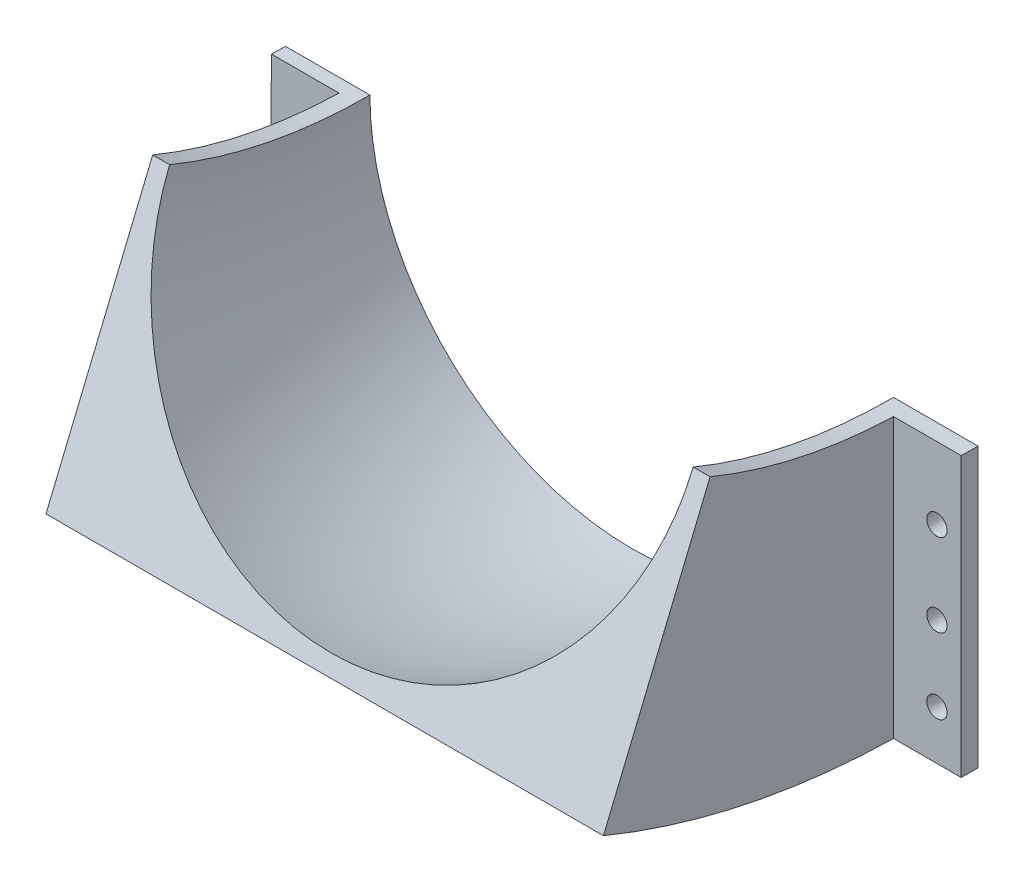
ISO-10303-21;
HEADER;
FILE_DESCRIPTION(('STEP AP214'),'2;1');
FILE_NAME('part.step','',(''),(''),'','','');
FILE_SCHEMA(('AUTOMOTIVE_DESIGN { 1 0 10303 214 1 1 1 1 }'));
ENDSEC;
DATA;
#1=APPLICATION_CONTEXT('core data for automotive mechanical design processes');
#2=APPLICATION_PROTOCOL_DEFINITION('international standard','automotive_design',2000,#1);
#3=PRODUCT_CONTEXT('',#1,'mechanical');
#4=PRODUCT('Part','Part','',(#3));
#5=PRODUCT_RELATED_PRODUCT_CATEGORY('part','',(#4));
#6=PRODUCT_DEFINITION_FORMATION('','',#4);
#7=PRODUCT_DEFINITION_CONTEXT('part definition',#1,'design');
#8=PRODUCT_DEFINITION('design','',#6,#7);
#9=PRODUCT_DEFINITION_SHAPE('','',#8);
#10=(LENGTH_UNIT() NAMED_UNIT(*) SI_UNIT(.MILLI.,.METRE.));
#11=(NAMED_UNIT(*) PLANE_ANGLE_UNIT() SI_UNIT($,.RADIAN.));
#12=(NAMED_UNIT(*) SI_UNIT($,.STERADIAN.) SOLID_ANGLE_UNIT());
#13=UNCERTAINTY_MEASURE_WITH_UNIT(LENGTH_MEASURE(1.E-05),#10,'distance_accuracy_value','');
#14=(GEOMETRIC_REPRESENTATION_CONTEXT(3) GLOBAL_UNCERTAINTY_ASSIGNED_CONTEXT((#13)) GLOBAL_UNIT_ASSIGNED_CONTEXT((#10,
#11,#12)) REPRESENTATION_CONTEXT('',''));
#15=CARTESIAN_POINT('',(0.,0.,0.));
#16=DIRECTION('',(0.,0.,1.));
#17=DIRECTION('',(1.,0.,0.));
#18=AXIS2_PLACEMENT_3D('',#15,#16,#17);
#19=CARTESIAN_POINT('',(52.4001999999994,-90.9328429874235,37.6656168305343));
#20=DIRECTION('',(-1.,0.,0.));
#21=DIRECTION('',(0.,0.,1.));
#22=AXIS2_PLACEMENT_3D('',#19,#20,#21);
#23=PLANE('',#22);
#24=DIRECTION('',(0.,-0.0105254294375171,-0.999944606133338));
#25=VECTOR('',#24,1.);
#26=CARTESIAN_POINT('',(52.4002000000002,-150.8252,0.));
#27=LINE('',#26,#25);
#28=CARTESIAN_POINT('',(52.4002000000002,-150.791781761536,3.17482412447336));
#29=VERTEX_POINT('',#28);
#30=CARTESIAN_POINT('',(52.4002,-150.8252,0.));
#31=VERTEX_POINT('',#30);
#32=EDGE_CURVE('E135',#29,#31,#27,.T.);
#33=ORIENTED_EDGE('',*,*,#32,.F.);
#34=CARTESIAN_POINT('',(52.4001999999987,4.33410518585465E-13,4.43591302579083E-13));
#35=DIRECTION('',(1.,0.,0.));
#36=DIRECTION('',(0.,0.,-1.));
#37=AXIS2_PLACEMENT_3D('',#34,#35,#36);
#38=CIRCLE('',#37,150.8252);
#39=EDGE_CURVE('E215',#29,#31,#38,.T.);
#40=ORIENTED_EDGE('',*,*,#39,.T.);
#41=EDGE_LOOP('',(#33,#40));
#42=FACE_BOUND('',#41,.T.);
#43=ADVANCED_FACE('F35',(#42),#23,.F.);
#44=DIRECTION('',(0.,-1.,0.));
#45=VECTOR('',#44,1.);
#46=CARTESIAN_POINT('',(52.4002000000002,-150.791781761536,3.17482412447336));
#47=LINE('',#46,#45);
#48=CARTESIAN_POINT('',(52.4002,-98.3737826698693,3.17482412447336));
#49=VERTEX_POINT('',#48);
#50=EDGE_CURVE('E52',#49,#29,#47,.T.);
#51=ORIENTED_EDGE('',*,*,#50,.F.);
#52=CARTESIAN_POINT('',(52.4001999999992,4.33410518585468E-13,4.43591302579087E-13));
#53=DIRECTION('',(1.,0.,0.));
#54=DIRECTION('',(0.,0.,-1.));
#55=AXIS2_PLACEMENT_3D('',#52,#53,#54);
#56=CIRCLE('',#55,98.4250000000005);
#57=CARTESIAN_POINT('',(52.4001999999996,-90.9328429874235,37.6656168305343));
#58=VERTEX_POINT('',#57);
#59=EDGE_CURVE('E44',#58,#49,#56,.T.);
#60=ORIENTED_EDGE('',*,*,#59,.F.);
#61=DIRECTION('',(0.,0.923879532511286,-0.382683432365091));
#62=VECTOR('',#61,1.);
#63=CARTESIAN_POINT('',(52.4001999999996,-90.9328429874235,37.6656168305343));
#64=LINE('',#63,#62);
#65=CARTESIAN_POINT('',(52.4001999999994,-139.344315266921,57.7183052231515));
#66=VERTEX_POINT('',#65);
#67=EDGE_CURVE('E168',#66,#58,#64,.T.);
#68=ORIENTED_EDGE('',*,*,#67,.F.);
#69=EDGE_CURVE('E149',#66,#29,#38,.T.);
#70=ORIENTED_EDGE('',*,*,#69,.T.);
#71=EDGE_LOOP('',(#51,#60,#68,#70));
#72=FACE_BOUND('',#71,.T.);
#73=ADVANCED_FACE('F220',(#72),#23,.F.);
#74=CARTESIAN_POINT('',(-52.4002000000006,-90.9328429874233,37.6656168305338));
#75=DIRECTION('',(1.,0.,0.));
#76=DIRECTION('',(0.,0.,-1.));
#77=AXIS2_PLACEMENT_3D('',#74,#75,#76);
#78=PLANE('',#77);
#79=DIRECTION('',(0.,0.999944606133338,-0.0105254294375171));
#80=VECTOR('',#79,1.);
#81=CARTESIAN_POINT('',(-52.4001999999998,-150.791781761536,3.17482412447336));
#82=LINE('',#81,#80);
#83=CARTESIAN_POINT('',(-52.4002,-150.791781761536,3.17482412447336));
#84=VERTEX_POINT('',#83);
#85=CARTESIAN_POINT('',(-52.4002000000002,-98.3900361965766,2.62324269489849));
#86=VERTEX_POINT('',#85);
#87=EDGE_CURVE('E60',#84,#86,#82,.T.);
#88=ORIENTED_EDGE('',*,*,#87,.F.);
#89=CARTESIAN_POINT('',(-52.4002000000012,-4.33410518585485E-13,-4.43591302579104E-13));
#90=DIRECTION('',(1.,0.,0.));
#91=DIRECTION('',(0.,0.,-1.));
#92=AXIS2_PLACEMENT_3D('',#89,#90,#91);
#93=CIRCLE('',#92,150.8252);
#94=CARTESIAN_POINT('',(-52.4002000000006,-139.344315266921,57.7183052231511));
#95=VERTEX_POINT('',#94);
#96=EDGE_CURVE('E159',#95,#84,#93,.T.);
#97=ORIENTED_EDGE('',*,*,#96,.F.);
#98=DIRECTION('',(0.,-0.923879532511286,0.382683432365091));
#99=VECTOR('',#98,1.);
#100=CARTESIAN_POINT('',(-52.4002000000004,-90.9328429874233,37.6656168305338));
#101=LINE('',#100,#99);
#102=CARTESIAN_POINT('',(-52.4002000000004,-90.9328429874233,37.6656168305338));
#103=VERTEX_POINT('',#102);
#104=EDGE_CURVE('E174',#103,#95,#101,.T.);
#105=ORIENTED_EDGE('',*,*,#104,.F.);
#106=CARTESIAN_POINT('',(-52.4002000000008,-4.33410518585482E-13,-4.43591302579101E-13));
#107=DIRECTION('',(1.,0.,0.));
#108=DIRECTION('',(0.,0.,-1.));
#109=AXIS2_PLACEMENT_3D('',#106,#107,#108);
#110=CIRCLE('',#109,98.4249999999996);
#111=EDGE_CURVE('E156',#103,#86,#110,.T.);
#112=ORIENTED_EDGE('',*,*,#111,.T.);
#113=EDGE_LOOP('',(#88,#97,#105,#112));
#114=FACE_BOUND('',#113,.T.);
#115=ADVANCED_FACE('F251',(#114),#78,.F.);
#116=CARTESIAN_POINT('',(-8.08335934173403E-13,0.,0.));
#117=DIRECTION('',(1.,0.,0.));
#118=DIRECTION('',(0.,0.,-1.));
#119=AXIS2_PLACEMENT_3D('',#116,#117,#118);
#120=TOROIDAL_SURFACE('',#119,98.425,49.2252);
#121=CARTESIAN_POINT('',(49.2251999999992,4.07149580716741E-13,4.16713497042302E-13));
#122=DIRECTION('',(1.,0.,0.));
#123=DIRECTION('',(0.,0.,-1.));
#124=AXIS2_PLACEMENT_3D('',#121,#122,#123);
#125=CIRCLE('',#124,98.4250000000004);
#126=CARTESIAN_POINT('',(49.2251999999996,-90.9328429874235,37.6656168305342));
#127=VERTEX_POINT('',#126);
#128=CARTESIAN_POINT('',(49.2252,-98.425,0.));
#129=VERTEX_POINT('',#128);
#130=EDGE_CURVE('E11',#127,#129,#125,.T.);
#131=ORIENTED_EDGE('',*,*,#130,.T.);
#132=CARTESIAN_POINT('',(0.,-98.425,0.));
#133=DIRECTION('',(0.,0.,-1.));
#134=DIRECTION('',(1.,0.,0.));
#135=AXIS2_PLACEMENT_3D('',#132,#133,#134);
#136=CIRCLE('',#135,49.2252);
#137=CARTESIAN_POINT('',(-49.2252,-98.425,0.));
#138=VERTEX_POINT('',#137);
#139=EDGE_CURVE('E190',#129,#138,#136,.T.);
#140=ORIENTED_EDGE('',*,*,#139,.T.);
#141=CARTESIAN_POINT('',(-49.2252000000008,-4.07149580716755E-13,-4.16713497042316E-13));
#142=DIRECTION('',(1.,0.,0.));
#143=DIRECTION('',(0.,0.,-1.));
#144=AXIS2_PLACEMENT_3D('',#141,#142,#143);
#145=CIRCLE('',#144,98.4249999999996);
#146=CARTESIAN_POINT('',(-49.2252000000004,-90.9328429874233,37.6656168305339));
#147=VERTEX_POINT('',#146);
#148=EDGE_CURVE('E160',#147,#138,#145,.T.);
#149=ORIENTED_EDGE('',*,*,#148,.F.);
#150=CARTESIAN_POINT('',(-3.78124512131155E-13,-90.9328429874234,37.665616830534));
#151=DIRECTION('',(0.,-0.382683432365091,-0.923879532511286));
#152=DIRECTION('',(1.,0.,0.));
#153=AXIS2_PLACEMENT_3D('',#150,#151,#152);
#154=CIRCLE('',#153,49.2252);
#155=EDGE_CURVE('E180',#127,#147,#154,.T.);
#156=ORIENTED_EDGE('',*,*,#155,.F.);
#157=EDGE_LOOP('',(#131,#140,#149,#156));
#158=FACE_BOUND('',#157,.T.);
#159=ADVANCED_FACE('F250',(#158),#120,.F.);
#160=CARTESIAN_POINT('',(-38.048924234204,-3.14708798515383E-13,-3.22101287071114E-13));
#161=DIRECTION('',(1.,0.,0.));
#162=DIRECTION('',(0.,0.,-1.));
#163=AXIS2_PLACEMENT_3D('',#160,#161,#162);
#164=CYLINDRICAL_SURFACE('',#163,98.4250000000004);
#165=ORIENTED_EDGE('',*,*,#59,.T.);
#166=DIRECTION('',(-1.,0.,0.));
#167=VECTOR('',#166,1.);
#168=CARTESIAN_POINT('',(65.1001999999997,-98.3737826698691,3.17482412447347));
#169=LINE('',#168,#167);
#170=CARTESIAN_POINT('',(65.1001999999997,-98.3737826698691,3.17482412447347));
#171=VERTEX_POINT('',#170);
#172=EDGE_CURVE('E120',#171,#49,#169,.T.);
#173=ORIENTED_EDGE('',*,*,#172,.F.);
#174=CARTESIAN_POINT('',(65.1001999999989,5.38454270060376E-13,5.51102524726224E-13));
#175=DIRECTION('',(-1.,0.,0.));
#176=DIRECTION('',(0.,0.,-1.));
#177=AXIS2_PLACEMENT_3D('',#174,#175,#176);
#178=CIRCLE('',#177,98.4250000000005);
#179=CARTESIAN_POINT('',(65.1001999999998,-98.4249999999999,1.07511222147137E-13));
#180=VERTEX_POINT('',#179);
#181=EDGE_CURVE('E126',#180,#171,#178,.T.);
#182=ORIENTED_EDGE('',*,*,#181,.F.);
#183=DIRECTION('',(-1.,0.,0.));
#184=VECTOR('',#183,1.);
#185=CARTESIAN_POINT('',(49.2252,-98.425,0.));
#186=LINE('',#185,#184);
#187=EDGE_CURVE('E183',#180,#129,#186,.T.);
#188=ORIENTED_EDGE('',*,*,#187,.T.);
#189=ORIENTED_EDGE('',*,*,#130,.F.);
#190=DIRECTION('',(-1.,0.,0.));
#191=VECTOR('',#190,1.);
#192=CARTESIAN_POINT('',(49.2251999999996,-90.9328429874235,37.6656168305342));
#193=LINE('',#192,#191);
#194=EDGE_CURVE('E165',#58,#127,#193,.T.);
#195=ORIENTED_EDGE('',*,*,#194,.F.);
#196=EDGE_LOOP('',(#165,#173,#182,#188,#189,#195));
#197=FACE_BOUND('',#196,.T.);
#198=ADVANCED_FACE('F37',(#197),#164,.F.);
#199=CARTESIAN_POINT('',(-38.048924234204,-3.14708798515383E-13,-3.22101287071114E-13));
#200=DIRECTION('',(1.,0.,0.));
#201=DIRECTION('',(0.,0.,-1.));
#202=AXIS2_PLACEMENT_3D('',#199,#200,#201);
#203=CYLINDRICAL_SURFACE('',#202,150.8252);
#204=ORIENTED_EDGE('',*,*,#96,.T.);
#205=DIRECTION('',(1.,0.,0.));
#206=VECTOR('',#205,1.);
#207=CARTESIAN_POINT('',(-65.1001999999998,-150.791781761536,3.1748241244732));
#208=LINE('',#207,#206);
#209=CARTESIAN_POINT('',(-65.1001999999998,-150.791781761536,3.1748241244732));
#210=VERTEX_POINT('',#209);
#211=EDGE_CURVE('E193',#210,#84,#208,.T.);
#212=ORIENTED_EDGE('',*,*,#211,.F.);
#213=CARTESIAN_POINT('',(-65.100200000001,-5.38454270060393E-13,-5.51102524726241E-13));
#214=DIRECTION('',(-1.,0.,0.));
#215=DIRECTION('',(0.,0.,1.));
#216=AXIS2_PLACEMENT_3D('',#213,#214,#215);
#217=CIRCLE('',#216,150.8252);
#218=CARTESIAN_POINT('',(-65.1001999999997,-150.8252,-1.07511222147137E-13));
#219=VERTEX_POINT('',#218);
#220=EDGE_CURVE('E212',#219,#210,#217,.T.);
#221=ORIENTED_EDGE('',*,*,#220,.F.);
#222=DIRECTION('',(1.,0.,0.));
#223=VECTOR('',#222,1.);
#224=CARTESIAN_POINT('',(-52.4002,-150.8252,0.));
#225=LINE('',#224,#223);
#226=EDGE_CURVE('E185',#219,#31,#225,.T.);
#227=ORIENTED_EDGE('',*,*,#226,.T.);
#228=ORIENTED_EDGE('',*,*,#39,.F.);
#229=ORIENTED_EDGE('',*,*,#69,.F.);
#230=DIRECTION('',(1.,0.,0.));
#231=VECTOR('',#230,1.);
#232=CARTESIAN_POINT('',(-52.4002000000006,-139.344315266921,57.7183052231511));
#233=LINE('',#232,#231);
#234=EDGE_CURVE('E171',#95,#66,#233,.T.);
#235=ORIENTED_EDGE('',*,*,#234,.F.);
#236=EDGE_LOOP('',(#204,#212,#221,#227,#228,#229,#235));
#237=FACE_BOUND('',#236,.T.);
#238=ADVANCED_FACE('F211',(#237),#203,.T.);
#239=CARTESIAN_POINT('',(-38.048924234204,-3.14708798515383E-13,-3.22101287071114E-13));
#240=DIRECTION('',(1.,0.,0.));
#241=DIRECTION('',(0.,0.,-1.));
#242=AXIS2_PLACEMENT_3D('',#239,#240,#241);
#243=CYLINDRICAL_SURFACE('',#242,98.4249999999996);
#244=DIRECTION('',(-1.,0.,0.));
#245=VECTOR('',#244,1.);
#246=CARTESIAN_POINT('',(-49.2252000000004,-90.9328429874233,37.6656168305339));
#247=LINE('',#246,#245);
#248=EDGE_CURVE('E177',#147,#103,#247,.T.);
#249=ORIENTED_EDGE('',*,*,#248,.F.);
#250=ORIENTED_EDGE('',*,*,#148,.T.);
#251=DIRECTION('',(-1.,0.,0.));
#252=VECTOR('',#251,1.);
#253=CARTESIAN_POINT('',(-49.2252,-98.425,0.));
#254=LINE('',#253,#252);
#255=CARTESIAN_POINT('',(-65.1002000000002,-98.4250000000002,-1.0751122214714E-13));
#256=VERTEX_POINT('',#255);
#257=EDGE_CURVE('E188',#138,#256,#254,.T.);
#258=ORIENTED_EDGE('',*,*,#257,.T.);
#259=CARTESIAN_POINT('',(-65.100200000001,-5.38454270060393E-13,-5.51102524726241E-13));
#260=DIRECTION('',(1.,0.,0.));
#261=DIRECTION('',(0.,0.,1.));
#262=AXIS2_PLACEMENT_3D('',#259,#260,#261);
#263=CIRCLE('',#262,98.4249999999996);
#264=CARTESIAN_POINT('',(-65.1002000000002,-98.3900361965768,2.62324269489838));
#265=VERTEX_POINT('',#264);
#266=EDGE_CURVE('E138',#265,#256,#263,.T.);
#267=ORIENTED_EDGE('',*,*,#266,.F.);
#268=DIRECTION('',(1.,0.,0.));
#269=VECTOR('',#268,1.);
#270=CARTESIAN_POINT('',(-65.1002000000002,-98.3900361965768,2.62324269489838));
#271=LINE('',#270,#269);
#272=EDGE_CURVE('E199',#265,#86,#271,.T.);
#273=ORIENTED_EDGE('',*,*,#272,.T.);
#274=ORIENTED_EDGE('',*,*,#111,.F.);
#275=EDGE_LOOP('',(#249,#250,#258,#267,#273,#274));
#276=FACE_BOUND('',#275,.T.);
#277=ADVANCED_FACE('F240',(#276),#243,.F.);
#278=CARTESIAN_POINT('',(-3.78124512131155E-13,-90.9328429874234,37.665616830534));
#279=DIRECTION('',(0.,0.382683432365091,0.923879532511286));
#280=DIRECTION('',(1.,0.,0.));
#281=AXIS2_PLACEMENT_3D('',#278,#279,#280);
#282=PLANE('',#281);
#283=ORIENTED_EDGE('',*,*,#155,.T.);
#284=ORIENTED_EDGE('',*,*,#248,.T.);
#285=ORIENTED_EDGE('',*,*,#104,.T.);
#286=ORIENTED_EDGE('',*,*,#234,.T.);
#287=ORIENTED_EDGE('',*,*,#67,.T.);
#288=ORIENTED_EDGE('',*,*,#194,.T.);
#289=EDGE_LOOP('',(#283,#284,#285,#286,#287,#288));
#290=FACE_BOUND('',#289,.T.);
#291=ADVANCED_FACE('F249',(#290),#282,.T.);
#292=CARTESIAN_POINT('',(0.,-98.425,0.));
#293=DIRECTION('',(0.,0.,1.));
#294=DIRECTION('',(1.,0.,0.));
#295=AXIS2_PLACEMENT_3D('',#292,#293,#294);
#296=PLANE('',#295);
#297=CARTESIAN_POINT('',(-60.7540190766187,-127.476625796266,0.));
#298=DIRECTION('',(0.,0.,1.));
#299=DIRECTION('',(-8.12512136115866E-13,1.,0.));
#300=AXIS2_PLACEMENT_3D('',#297,#298,#299);
#301=ELLIPSE('',#300,1.90510553116177,1.905);
#302=CARTESIAN_POINT('',(-60.7540190766202,-125.571520265105,0.));
#303=VERTEX_POINT('',#302);
#304=EDGE_CURVE('E478',#303,#303,#301,.T.);
#305=ORIENTED_EDGE('',*,*,#304,.T.);
#306=EDGE_LOOP('',(#305));
#307=FACE_BOUND('',#306,.T.);
#308=CARTESIAN_POINT('',(-60.7540190766187,-112.510793894045,0.));
#309=DIRECTION('',(0.,0.,1.));
#310=DIRECTION('',(-8.12512136115866E-13,1.,0.));
#311=AXIS2_PLACEMENT_3D('',#308,#309,#310);
#312=ELLIPSE('',#311,1.90510553116177,1.905);
#313=CARTESIAN_POINT('',(-60.7540190766202,-110.605688362883,0.));
#314=VERTEX_POINT('',#313);
#315=EDGE_CURVE('E439',#314,#314,#312,.T.);
#316=ORIENTED_EDGE('',*,*,#315,.T.);
#317=EDGE_LOOP('',(#316));
#318=FACE_BOUND('',#317,.T.);
#319=CARTESIAN_POINT('',(-60.7540190766187,-141.55484402201,0.));
#320=DIRECTION('',(0.,0.,1.));
#321=DIRECTION('',(-8.12512136115866E-13,1.,0.));
#322=AXIS2_PLACEMENT_3D('',#319,#320,#321);
#323=ELLIPSE('',#322,1.90510553116177,1.905);
#324=CARTESIAN_POINT('',(-60.7540190766202,-139.649738490849,0.));
#325=VERTEX_POINT('',#324);
#326=EDGE_CURVE('E438',#325,#325,#323,.T.);
#327=ORIENTED_EDGE('',*,*,#326,.T.);
#328=EDGE_LOOP('',(#327));
#329=FACE_BOUND('',#328,.T.);
#330=CARTESIAN_POINT('',(60.5501864239795,-127.4445,0.));
#331=DIRECTION('',(0.,0.,1.));
#332=DIRECTION('',(1.,0.,0.));
#333=AXIS2_PLACEMENT_3D('',#330,#331,#332);
#334=CIRCLE('',#333,1.905);
#335=CARTESIAN_POINT('',(62.4551864239795,-127.4445,0.));
#336=VERTEX_POINT('',#335);
#337=EDGE_CURVE('E450',#336,#336,#334,.T.);
#338=ORIENTED_EDGE('',*,*,#337,.T.);
#339=EDGE_LOOP('',(#338));
#340=FACE_BOUND('',#339,.T.);
#341=CARTESIAN_POINT('',(60.5501864239795,-141.566764632731,0.));
#342=DIRECTION('',(0.,0.,1.));
#343=DIRECTION('',(1.,0.,0.));
#344=AXIS2_PLACEMENT_3D('',#341,#342,#343);
#345=CIRCLE('',#344,1.905);
#346=CARTESIAN_POINT('',(62.4551864239795,-141.566764632731,0.));
#347=VERTEX_POINT('',#346);
#348=EDGE_CURVE('E456',#347,#347,#345,.T.);
#349=ORIENTED_EDGE('',*,*,#348,.T.);
#350=EDGE_LOOP('',(#349));
#351=FACE_BOUND('',#350,.T.);
#352=CARTESIAN_POINT('',(60.5501864239795,-111.886000657208,0.));
#353=DIRECTION('',(0.,0.,1.));
#354=DIRECTION('',(1.,0.,0.));
#355=AXIS2_PLACEMENT_3D('',#352,#353,#354);
#356=CIRCLE('',#355,1.905);
#357=CARTESIAN_POINT('',(62.4551864239795,-111.886000657208,0.));
#358=VERTEX_POINT('',#357);
#359=EDGE_CURVE('E146',#358,#358,#356,.T.);
#360=ORIENTED_EDGE('',*,*,#359,.T.);
#361=EDGE_LOOP('',(#360));
#362=FACE_BOUND('',#361,.T.);
#363=ORIENTED_EDGE('',*,*,#139,.F.);
#364=ORIENTED_EDGE('',*,*,#187,.F.);
#365=DIRECTION('',(0.,1.,0.));
#366=VECTOR('',#365,1.);
#367=CARTESIAN_POINT('',(65.1001999999998,-98.4249999999999,1.07511222147137E-13));
#368=LINE('',#367,#366);
#369=CARTESIAN_POINT('',(65.1002000000002,-150.8252,1.0751122214714E-13));
#370=VERTEX_POINT('',#369);
#371=EDGE_CURVE('E132',#370,#180,#368,.T.);
#372=ORIENTED_EDGE('',*,*,#371,.F.);
#373=DIRECTION('',(-1.,0.,0.));
#374=VECTOR('',#373,1.);
#375=CARTESIAN_POINT('',(65.1002000000002,-150.8252,1.0751122214714E-13));
#376=LINE('',#375,#374);
#377=EDGE_CURVE('E140',#370,#31,#376,.T.);
#378=ORIENTED_EDGE('',*,*,#377,.T.);
#379=ORIENTED_EDGE('',*,*,#226,.F.);
#380=DIRECTION('',(0.,-1.,0.));
#381=VECTOR('',#380,1.);
#382=CARTESIAN_POINT('',(-65.1002000000002,-98.4250000000002,-1.0751122214714E-13));
#383=LINE('',#382,#381);
#384=EDGE_CURVE('E233',#256,#219,#383,.T.);
#385=ORIENTED_EDGE('',*,*,#384,.F.);
#386=ORIENTED_EDGE('',*,*,#257,.F.);
#387=EDGE_LOOP('',(#363,#364,#372,#378,#379,#385,#386));
#388=FACE_BOUND('',#387,.T.);
#389=ADVANCED_FACE('F245',(#307,#318,#329,#340,#351,#362,#388),#296,.F.);
#390=CARTESIAN_POINT('',(-65.1001999999998,-150.791781761536,3.17482412447325));
#391=DIRECTION('',(0.,-0.0105254294375171,-0.999944606133338));
#392=DIRECTION('',(0.,0.999944606133338,-0.0105254294375171));
#393=AXIS2_PLACEMENT_3D('',#390,#391,#392);
#394=PLANE('',#393);
#395=CARTESIAN_POINT('',(-60.7540190766187,-127.44579422177,2.92908396747684));
#396=DIRECTION('',(0.,0.0105254294375171,0.999944606133338));
#397=DIRECTION('',(0.,-0.999944606133338,0.0105254294375171));
#398=AXIS2_PLACEMENT_3D('',#395,#396,#397);
#399=CIRCLE('',#398,1.905);
#400=CARTESIAN_POINT('',(-60.7540190766187,-129.350688696454,2.94913491055531));
#401=VERTEX_POINT('',#400);
#402=EDGE_CURVE('E430',#401,#401,#399,.T.);
#403=ORIENTED_EDGE('',*,*,#402,.F.);
#404=EDGE_LOOP('',(#403));
#405=FACE_BOUND('',#404,.T.);
#406=CARTESIAN_POINT('',(-60.7540190766187,-112.48162030422,2.77157088555827));
#407=DIRECTION('',(0.,0.0105254294375171,0.999944606133338));
#408=DIRECTION('',(0.,-0.999944606133338,0.0105254294375171));
#409=AXIS2_PLACEMENT_3D('',#406,#407,#408);
#410=CIRCLE('',#409,1.905);
#411=CARTESIAN_POINT('',(-60.7540190766187,-114.386514778904,2.79162182863674));
#412=VERTEX_POINT('',#411);
#413=EDGE_CURVE('E434',#412,#412,#410,.T.);
#414=ORIENTED_EDGE('',*,*,#413,.F.);
#415=EDGE_LOOP('',(#414));
#416=FACE_BOUND('',#415,.T.);
#417=CARTESIAN_POINT('',(-60.7540190766187,-141.522452796826,3.0772550517939));
#418=DIRECTION('',(0.,0.0105254294375171,0.999944606133338));
#419=DIRECTION('',(0.,-0.999944606133338,0.0105254294375171));
#420=AXIS2_PLACEMENT_3D('',#417,#418,#419);
#421=CIRCLE('',#420,1.905);
#422=CARTESIAN_POINT('',(-60.7540190766187,-143.42734727151,3.09730599487237));
#423=VERTEX_POINT('',#422);
#424=EDGE_CURVE('E437',#423,#423,#421,.T.);
#425=ORIENTED_EDGE('',*,*,#424,.F.);
#426=EDGE_LOOP('',(#425));
#427=FACE_BOUND('',#426,.T.);
#428=ORIENTED_EDGE('',*,*,#87,.T.);
#429=ORIENTED_EDGE('',*,*,#272,.F.);
#430=DIRECTION('',(0.,0.999944606133338,-0.0105254294375171));
#431=VECTOR('',#430,1.);
#432=CARTESIAN_POINT('',(-65.1001999999998,-150.791781761536,3.17482412447325));
#433=LINE('',#432,#431);
#434=EDGE_CURVE('E196',#210,#265,#433,.T.);
#435=ORIENTED_EDGE('',*,*,#434,.F.);
#436=ORIENTED_EDGE('',*,*,#211,.T.);
#437=EDGE_LOOP('',(#428,#429,#435,#436));
#438=FACE_BOUND('',#437,.T.);
#439=ADVANCED_FACE('F207',(#405,#416,#427,#438),#394,.F.);
#440=CARTESIAN_POINT('',(-65.100200000001,-5.38454270060393E-13,-5.51102524726241E-13));
#441=DIRECTION('',(-1.,0.,0.));
#442=DIRECTION('',(0.,0.,1.));
#443=AXIS2_PLACEMENT_3D('',#440,#441,#442);
#444=PLANE('',#443);
#445=ORIENTED_EDGE('',*,*,#266,.T.);
#446=ORIENTED_EDGE('',*,*,#384,.T.);
#447=ORIENTED_EDGE('',*,*,#220,.T.);
#448=ORIENTED_EDGE('',*,*,#434,.T.);
#449=EDGE_LOOP('',(#445,#446,#447,#448));
#450=FACE_BOUND('',#449,.T.);
#451=ADVANCED_FACE('F236',(#450),#444,.T.);
#452=CARTESIAN_POINT('',(65.1002000000002,-150.791781761536,3.17482412447347));
#453=DIRECTION('',(0.,0.,-1.));
#454=DIRECTION('',(-1.,0.,0.));
#455=AXIS2_PLACEMENT_3D('',#452,#453,#454);
#456=PLANE('',#455);
#457=CARTESIAN_POINT('',(60.5501864239795,-127.4445,3.17482412447291));
#458=DIRECTION('',(0.,0.,1.));
#459=DIRECTION('',(1.,0.,0.));
#460=AXIS2_PLACEMENT_3D('',#457,#458,#459);
#461=CIRCLE('',#460,1.905);
#462=CARTESIAN_POINT('',(62.4551864239795,-127.4445,3.17482412447291));
#463=VERTEX_POINT('',#462);
#464=EDGE_CURVE('E442',#463,#463,#461,.T.);
#465=ORIENTED_EDGE('',*,*,#464,.F.);
#466=EDGE_LOOP('',(#465));
#467=FACE_BOUND('',#466,.T.);
#468=CARTESIAN_POINT('',(60.5501864239795,-141.566764632731,3.17482412447291));
#469=DIRECTION('',(0.,0.,1.));
#470=DIRECTION('',(1.,0.,0.));
#471=AXIS2_PLACEMENT_3D('',#468,#469,#470);
#472=CIRCLE('',#471,1.905);
#473=CARTESIAN_POINT('',(62.4551864239795,-141.566764632731,3.17482412447291));
#474=VERTEX_POINT('',#473);
#475=EDGE_CURVE('E453',#474,#474,#472,.T.);
#476=ORIENTED_EDGE('',*,*,#475,.F.);
#477=EDGE_LOOP('',(#476));
#478=FACE_BOUND('',#477,.T.);
#479=CARTESIAN_POINT('',(60.5501864239795,-111.886000657208,3.17482412447291));
#480=DIRECTION('',(0.,0.,1.));
#481=DIRECTION('',(1.,0.,0.));
#482=AXIS2_PLACEMENT_3D('',#479,#480,#481);
#483=CIRCLE('',#482,1.905);
#484=CARTESIAN_POINT('',(62.4551864239795,-111.886000657208,3.17482412447291));
#485=VERTEX_POINT('',#484);
#486=EDGE_CURVE('E459',#485,#485,#483,.T.);
#487=ORIENTED_EDGE('',*,*,#486,.F.);
#488=EDGE_LOOP('',(#487));
#489=FACE_BOUND('',#488,.T.);
#490=ORIENTED_EDGE('',*,*,#50,.T.);
#491=DIRECTION('',(-1.,0.,0.));
#492=VECTOR('',#491,1.);
#493=CARTESIAN_POINT('',(65.1002000000002,-150.791781761536,3.17482412447347));
#494=LINE('',#493,#492);
#495=CARTESIAN_POINT('',(65.1002000000002,-150.791781761536,3.17482412447347));
#496=VERTEX_POINT('',#495);
#497=EDGE_CURVE('E122',#496,#29,#494,.T.);
#498=ORIENTED_EDGE('',*,*,#497,.F.);
#499=DIRECTION('',(0.,-1.,0.));
#500=VECTOR('',#499,1.);
#501=CARTESIAN_POINT('',(65.1002000000002,-150.791781761536,3.17482412447347));
#502=LINE('',#501,#500);
#503=EDGE_CURVE('E116',#171,#496,#502,.T.);
#504=ORIENTED_EDGE('',*,*,#503,.F.);
#505=ORIENTED_EDGE('',*,*,#172,.T.);
#506=EDGE_LOOP('',(#490,#498,#504,#505));
#507=FACE_BOUND('',#506,.T.);
#508=ADVANCED_FACE('F118',(#467,#478,#489,#507),#456,.F.);
#509=CARTESIAN_POINT('',(65.1002000000002,-150.8252,1.0751122214714E-13));
#510=DIRECTION('',(0.,0.999944606133338,-0.0105254294375171));
#511=DIRECTION('',(0.,0.0105254294375171,0.999944606133338));
#512=AXIS2_PLACEMENT_3D('',#509,#510,#511);
#513=PLANE('',#512);
#514=ORIENTED_EDGE('',*,*,#32,.T.);
#515=ORIENTED_EDGE('',*,*,#377,.F.);
#516=DIRECTION('',(0.,-0.0105254294375171,-0.999944606133338));
#517=VECTOR('',#516,1.);
#518=CARTESIAN_POINT('',(65.1002000000002,-150.8252,1.0751122214714E-13));
#519=LINE('',#518,#517);
#520=EDGE_CURVE('E125',#496,#370,#519,.T.);
#521=ORIENTED_EDGE('',*,*,#520,.F.);
#522=ORIENTED_EDGE('',*,*,#497,.T.);
#523=EDGE_LOOP('',(#514,#515,#521,#522));
#524=FACE_BOUND('',#523,.T.);
#525=ADVANCED_FACE('F226',(#524),#513,.F.);
#526=CARTESIAN_POINT('',(65.1001999999989,5.38454270060376E-13,5.51102524726224E-13));
#527=DIRECTION('',(1.,0.,0.));
#528=DIRECTION('',(0.,0.,-1.));
#529=AXIS2_PLACEMENT_3D('',#526,#527,#528);
#530=PLANE('',#529);
#531=ORIENTED_EDGE('',*,*,#181,.T.);
#532=ORIENTED_EDGE('',*,*,#503,.T.);
#533=ORIENTED_EDGE('',*,*,#520,.T.);
#534=ORIENTED_EDGE('',*,*,#371,.T.);
#535=EDGE_LOOP('',(#531,#532,#533,#534));
#536=FACE_BOUND('',#535,.T.);
#537=ADVANCED_FACE('F130',(#536),#530,.T.);
#538=CARTESIAN_POINT('',(60.5501864239795,-111.886000657208,-0.000175875527087289));
#539=DIRECTION('',(0.,0.,1.));
#540=DIRECTION('',(1.,0.,0.));
#541=AXIS2_PLACEMENT_3D('',#538,#539,#540);
#542=CYLINDRICAL_SURFACE('',#541,1.905);
#543=ORIENTED_EDGE('',*,*,#486,.T.);
#544=EDGE_LOOP('',(#543));
#545=FACE_BOUND('',#544,.T.);
#546=ORIENTED_EDGE('',*,*,#359,.F.);
#547=EDGE_LOOP('',(#546));
#548=FACE_BOUND('',#547,.T.);
#549=ADVANCED_FACE('F361',(#545,#548),#542,.F.);
#550=CARTESIAN_POINT('',(60.5501864239795,-141.566764632731,-0.000175875527087289));
#551=DIRECTION('',(0.,0.,1.));
#552=DIRECTION('',(1.,0.,0.));
#553=AXIS2_PLACEMENT_3D('',#550,#551,#552);
#554=CYLINDRICAL_SURFACE('',#553,1.905);
#555=ORIENTED_EDGE('',*,*,#475,.T.);
#556=EDGE_LOOP('',(#555));
#557=FACE_BOUND('',#556,.T.);
#558=ORIENTED_EDGE('',*,*,#348,.F.);
#559=EDGE_LOOP('',(#558));
#560=FACE_BOUND('',#559,.T.);
#561=ADVANCED_FACE('F368',(#557,#560),#554,.F.);
#562=CARTESIAN_POINT('',(60.5501864239795,-127.4445,-0.000175875527087289));
#563=DIRECTION('',(0.,0.,1.));
#564=DIRECTION('',(1.,0.,0.));
#565=AXIS2_PLACEMENT_3D('',#562,#563,#564);
#566=CYLINDRICAL_SURFACE('',#565,1.905);
#567=ORIENTED_EDGE('',*,*,#464,.T.);
#568=EDGE_LOOP('',(#567));
#569=FACE_BOUND('',#568,.T.);
#570=ORIENTED_EDGE('',*,*,#337,.F.);
#571=EDGE_LOOP('',(#570));
#572=FACE_BOUND('',#571,.T.);
#573=ADVANCED_FACE('F377',(#569,#572),#566,.F.);
#574=CARTESIAN_POINT('',(-60.7540190766187,-141.55587103529,-0.0975690726794454));
#575=DIRECTION('',(0.,0.0105254294375171,0.999944606133338));
#576=DIRECTION('',(0.,-0.999944606133338,0.0105254294375171));
#577=AXIS2_PLACEMENT_3D('',#574,#575,#576);
#578=CYLINDRICAL_SURFACE('',#577,1.905);
#579=ORIENTED_EDGE('',*,*,#424,.T.);
#580=EDGE_LOOP('',(#579));
#581=FACE_BOUND('',#580,.T.);
#582=ORIENTED_EDGE('',*,*,#326,.F.);
#583=EDGE_LOOP('',(#582));
#584=FACE_BOUND('',#583,.T.);
#585=ADVANCED_FACE('F385',(#581,#584),#578,.F.);
#586=CARTESIAN_POINT('',(-60.7540190766187,-112.515038542684,-0.403253238915073));
#587=DIRECTION('',(0.,0.0105254294375171,0.999944606133338));
#588=DIRECTION('',(0.,-0.999944606133338,0.0105254294375171));
#589=AXIS2_PLACEMENT_3D('',#586,#587,#588);
#590=CYLINDRICAL_SURFACE('',#589,1.905);
#591=ORIENTED_EDGE('',*,*,#413,.T.);
#592=EDGE_LOOP('',(#591));
#593=FACE_BOUND('',#592,.T.);
#594=ORIENTED_EDGE('',*,*,#315,.F.);
#595=EDGE_LOOP('',(#594));
#596=FACE_BOUND('',#595,.T.);
#597=ADVANCED_FACE('F394',(#593,#596),#590,.F.);
#598=CARTESIAN_POINT('',(-60.7540190766187,-127.479212460234,-0.24574015699651));
#599=DIRECTION('',(0.,0.0105254294375171,0.999944606133338));
#600=DIRECTION('',(0.,-0.999944606133338,0.0105254294375171));
#601=AXIS2_PLACEMENT_3D('',#598,#599,#600);
#602=CYLINDRICAL_SURFACE('',#601,1.905);
#603=ORIENTED_EDGE('',*,*,#402,.T.);
#604=EDGE_LOOP('',(#603));
#605=FACE_BOUND('',#604,.T.);
#606=ORIENTED_EDGE('',*,*,#304,.F.);
#607=EDGE_LOOP('',(#606));
#608=FACE_BOUND('',#607,.T.);
#609=ADVANCED_FACE('F403',(#605,#608),#602,.F.);
#610=CLOSED_SHELL('',(#43,#73,#115,#159,#198,#238,#277,#291,#389,#439,#451,#508,#525,#537,#549,
#561,#573,#585,#597,#609));
#611=MANIFOLD_SOLID_BREP('B2',#610);
#612=ADVANCED_BREP_SHAPE_REPRESENTATION('',(#18,#611),#14);
#613=SHAPE_DEFINITION_REPRESENTATION(#9,#612);
ENDSEC;
END-ISO-10303-21;
